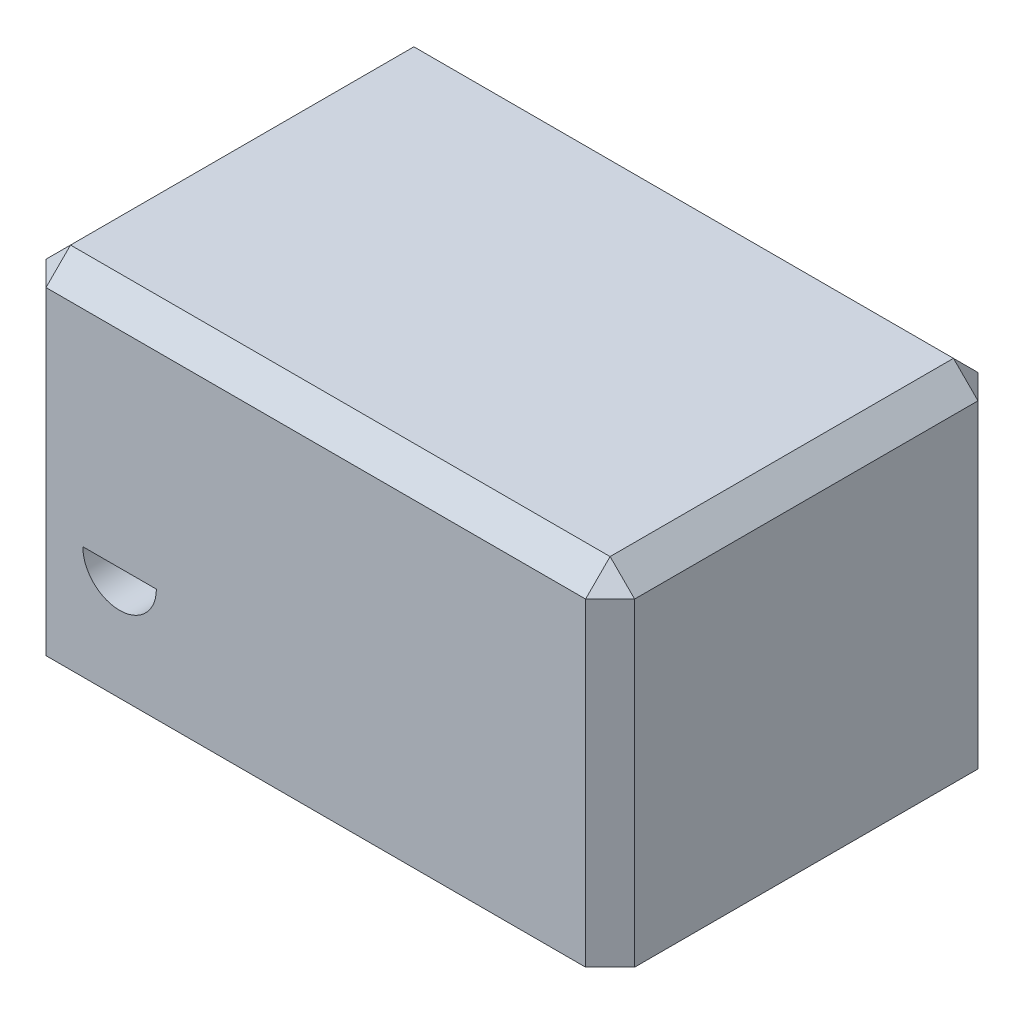
ISO-10303-21;
HEADER;
FILE_DESCRIPTION(('STEP AP214'),'2;1');
FILE_NAME('part.step','',(''),(''),'','','');
FILE_SCHEMA(('AUTOMOTIVE_DESIGN { 1 0 10303 214 1 1 1 1 }'));
ENDSEC;
DATA;
#1=APPLICATION_CONTEXT('core data for automotive mechanical design processes');
#2=APPLICATION_PROTOCOL_DEFINITION('international standard','automotive_design',2000,#1);
#3=PRODUCT_CONTEXT('',#1,'mechanical');
#4=PRODUCT('Part','Part','',(#3));
#5=PRODUCT_RELATED_PRODUCT_CATEGORY('part','',(#4));
#6=PRODUCT_DEFINITION_FORMATION('','',#4);
#7=PRODUCT_DEFINITION_CONTEXT('part definition',#1,'design');
#8=PRODUCT_DEFINITION('design','',#6,#7);
#9=PRODUCT_DEFINITION_SHAPE('','',#8);
#10=(LENGTH_UNIT() NAMED_UNIT(*) SI_UNIT(.MILLI.,.METRE.));
#11=(NAMED_UNIT(*) PLANE_ANGLE_UNIT() SI_UNIT($,.RADIAN.));
#12=(NAMED_UNIT(*) SI_UNIT($,.STERADIAN.) SOLID_ANGLE_UNIT());
#13=UNCERTAINTY_MEASURE_WITH_UNIT(LENGTH_MEASURE(1.E-05),#10,'distance_accuracy_value','');
#14=(GEOMETRIC_REPRESENTATION_CONTEXT(3) GLOBAL_UNCERTAINTY_ASSIGNED_CONTEXT((#13)) GLOBAL_UNIT_ASSIGNED_CONTEXT((#10,
#11,#12)) REPRESENTATION_CONTEXT('',''));
#15=CARTESIAN_POINT('',(0.,0.,0.));
#16=DIRECTION('',(0.,0.,1.));
#17=DIRECTION('',(1.,0.,0.));
#18=AXIS2_PLACEMENT_3D('',#15,#16,#17);
#19=CARTESIAN_POINT('',(0.,0.,-80.));
#20=DIRECTION('',(0.,0.,1.));
#21=DIRECTION('',(1.,0.,0.));
#22=AXIS2_PLACEMENT_3D('',#19,#20,#21);
#23=PLANE('',#22);
#24=DIRECTION('',(1.,0.,0.));
#25=VECTOR('',#24,1.);
#26=CARTESIAN_POINT('',(0.,65.,-80.));
#27=LINE('',#26,#25);
#28=CARTESIAN_POINT('',(5.00000000000002,65.,-80.));
#29=VERTEX_POINT('',#28);
#30=CARTESIAN_POINT('',(115.,65.,-80.));
#31=VERTEX_POINT('',#30);
#32=EDGE_CURVE('E181',#29,#31,#27,.T.);
#33=ORIENTED_EDGE('',*,*,#32,.T.);
#34=DIRECTION('',(0.,-1.,0.));
#35=VECTOR('',#34,1.);
#36=CARTESIAN_POINT('',(115.,0.,-80.));
#37=LINE('',#36,#35);
#38=CARTESIAN_POINT('',(115.,0.,-80.));
#39=VERTEX_POINT('',#38);
#40=EDGE_CURVE('E183',#31,#39,#37,.T.);
#41=ORIENTED_EDGE('',*,*,#40,.T.);
#42=DIRECTION('',(1.,0.,0.));
#43=VECTOR('',#42,1.);
#44=CARTESIAN_POINT('',(0.,0.,-80.));
#45=LINE('',#44,#43);
#46=CARTESIAN_POINT('',(5.00000000000002,0.,-80.));
#47=VERTEX_POINT('',#46);
#48=EDGE_CURVE('E146',#47,#39,#45,.T.);
#49=ORIENTED_EDGE('',*,*,#48,.F.);
#50=DIRECTION('',(0.,1.,0.));
#51=VECTOR('',#50,1.);
#52=CARTESIAN_POINT('',(5.00000000000002,0.,-80.));
#53=LINE('',#52,#51);
#54=EDGE_CURVE('E179',#47,#29,#53,.T.);
#55=ORIENTED_EDGE('',*,*,#54,.T.);
#56=EDGE_LOOP('',(#33,#41,#49,#55));
#57=FACE_BOUND('',#56,.T.);
#58=DIRECTION('',(1.,0.,0.));
#59=VECTOR('',#58,1.);
#60=CARTESIAN_POINT('',(12.5,23.,-80.));
#61=LINE('',#60,#59);
#62=CARTESIAN_POINT('',(12.5,23.,-80.));
#63=VERTEX_POINT('',#62);
#64=CARTESIAN_POINT('',(27.5,23.,-80.));
#65=VERTEX_POINT('',#64);
#66=EDGE_CURVE('E131',#63,#65,#61,.T.);
#67=ORIENTED_EDGE('',*,*,#66,.F.);
#68=CARTESIAN_POINT('',(20.,23.,-80.));
#69=DIRECTION('',(0.,0.,1.));
#70=DIRECTION('',(1.,0.,0.));
#71=AXIS2_PLACEMENT_3D('',#68,#69,#70);
#72=CIRCLE('',#71,7.50000000000001);
#73=EDGE_CURVE('E134',#63,#65,#72,.T.);
#74=ORIENTED_EDGE('',*,*,#73,.T.);
#75=EDGE_LOOP('',(#67,#74));
#76=FACE_BOUND('',#75,.T.);
#77=ADVANCED_FACE('F39',(#57,#76),#23,.F.);
#78=CARTESIAN_POINT('',(0.,0.,0.));
#79=DIRECTION('',(0.,0.,1.));
#80=DIRECTION('',(1.,0.,0.));
#81=AXIS2_PLACEMENT_3D('',#78,#79,#80);
#82=PLANE('',#81);
#83=DIRECTION('',(1.,0.,0.));
#84=VECTOR('',#83,1.);
#85=CARTESIAN_POINT('',(0.,0.,0.));
#86=LINE('',#85,#84);
#87=CARTESIAN_POINT('',(5.00000000000002,0.,0.));
#88=VERTEX_POINT('',#87);
#89=CARTESIAN_POINT('',(115.,0.,0.));
#90=VERTEX_POINT('',#89);
#91=EDGE_CURVE('E150',#88,#90,#86,.T.);
#92=ORIENTED_EDGE('',*,*,#91,.T.);
#93=DIRECTION('',(0.,1.,0.));
#94=VECTOR('',#93,1.);
#95=CARTESIAN_POINT('',(115.,1.8239378261699E-13,0.));
#96=LINE('',#95,#94);
#97=CARTESIAN_POINT('',(115.,65.,0.));
#98=VERTEX_POINT('',#97);
#99=EDGE_CURVE('E162',#90,#98,#96,.T.);
#100=ORIENTED_EDGE('',*,*,#99,.T.);
#101=DIRECTION('',(-1.,0.,0.));
#102=VECTOR('',#101,1.);
#103=CARTESIAN_POINT('',(0.,65.,0.));
#104=LINE('',#103,#102);
#105=CARTESIAN_POINT('',(5.00000000000002,65.,0.));
#106=VERTEX_POINT('',#105);
#107=EDGE_CURVE('E160',#98,#106,#104,.T.);
#108=ORIENTED_EDGE('',*,*,#107,.T.);
#109=DIRECTION('',(0.,-1.,0.));
#110=VECTOR('',#109,1.);
#111=CARTESIAN_POINT('',(5.00000000000002,0.,0.));
#112=LINE('',#111,#110);
#113=EDGE_CURVE('E156',#106,#88,#112,.T.);
#114=ORIENTED_EDGE('',*,*,#113,.T.);
#115=EDGE_LOOP('',(#92,#100,#108,#114));
#116=FACE_BOUND('',#115,.T.);
#117=CARTESIAN_POINT('',(20.,23.,0.));
#118=DIRECTION('',(0.,0.,1.));
#119=DIRECTION('',(1.,0.,0.));
#120=AXIS2_PLACEMENT_3D('',#117,#118,#119);
#121=CIRCLE('',#120,7.50000000000001);
#122=CARTESIAN_POINT('',(12.5,23.,0.));
#123=VERTEX_POINT('',#122);
#124=CARTESIAN_POINT('',(27.5,23.,0.));
#125=VERTEX_POINT('',#124);
#126=EDGE_CURVE('E139',#123,#125,#121,.T.);
#127=ORIENTED_EDGE('',*,*,#126,.F.);
#128=DIRECTION('',(1.,0.,0.));
#129=VECTOR('',#128,1.);
#130=CARTESIAN_POINT('',(12.5,23.,0.));
#131=LINE('',#130,#129);
#132=EDGE_CURVE('E64',#123,#125,#131,.T.);
#133=ORIENTED_EDGE('',*,*,#132,.T.);
#134=EDGE_LOOP('',(#127,#133));
#135=FACE_BOUND('',#134,.T.);
#136=ADVANCED_FACE('F295',(#116,#135),#82,.T.);
#137=CARTESIAN_POINT('',(0.,0.,-80.));
#138=DIRECTION('',(0.,-1.,0.));
#139=DIRECTION('',(0.,0.,-1.));
#140=AXIS2_PLACEMENT_3D('',#137,#138,#139);
#141=PLANE('',#140);
#142=DIRECTION('',(0.,0.,1.));
#143=VECTOR('',#142,1.);
#144=CARTESIAN_POINT('',(120.,0.,-80.));
#145=LINE('',#144,#143);
#146=CARTESIAN_POINT('',(120.,0.,-75.));
#147=VERTEX_POINT('',#146);
#148=CARTESIAN_POINT('',(120.,0.,-5.00000000000002));
#149=VERTEX_POINT('',#148);
#150=EDGE_CURVE('E149',#147,#149,#145,.T.);
#151=ORIENTED_EDGE('',*,*,#150,.T.);
#152=DIRECTION('',(0.707106781186548,0.,-0.707106781186548));
#153=VECTOR('',#152,1.);
#154=CARTESIAN_POINT('',(97.5,0.,17.5));
#155=LINE('',#154,#153);
#156=EDGE_CURVE('E177',#149,#90,#155,.F.);
#157=ORIENTED_EDGE('',*,*,#156,.T.);
#158=ORIENTED_EDGE('',*,*,#91,.F.);
#159=DIRECTION('',(-0.707106781186548,0.,-0.707106781186548));
#160=VECTOR('',#159,1.);
#161=CARTESIAN_POINT('',(-37.5,0.,-42.5));
#162=LINE('',#161,#160);
#163=CARTESIAN_POINT('',(0.,0.,-5.00000000000002));
#164=VERTEX_POINT('',#163);
#165=EDGE_CURVE('E171',#88,#164,#162,.T.);
#166=ORIENTED_EDGE('',*,*,#165,.T.);
#167=DIRECTION('',(0.,0.,1.));
#168=VECTOR('',#167,1.);
#169=CARTESIAN_POINT('',(0.,0.,-80.));
#170=LINE('',#169,#168);
#171=CARTESIAN_POINT('',(0.,0.,-75.));
#172=VERTEX_POINT('',#171);
#173=EDGE_CURVE('E153',#172,#164,#170,.T.);
#174=ORIENTED_EDGE('',*,*,#173,.F.);
#175=DIRECTION('',(-0.707106781186548,0.,0.707106781186548));
#176=VECTOR('',#175,1.);
#177=CARTESIAN_POINT('',(2.50000000000001,0.,-77.5));
#178=LINE('',#177,#176);
#179=EDGE_CURVE('E173',#172,#47,#178,.F.);
#180=ORIENTED_EDGE('',*,*,#179,.T.);
#181=ORIENTED_EDGE('',*,*,#48,.T.);
#182=DIRECTION('',(0.707106781186548,0.,0.707106781186548));
#183=VECTOR('',#182,1.);
#184=CARTESIAN_POINT('',(57.5,0.,-137.5));
#185=LINE('',#184,#183);
#186=EDGE_CURVE('E175',#39,#147,#185,.T.);
#187=ORIENTED_EDGE('',*,*,#186,.T.);
#188=EDGE_LOOP('',(#151,#157,#158,#166,#174,#180,#181,#187));
#189=FACE_BOUND('',#188,.T.);
#190=ADVANCED_FACE('F244',(#189),#141,.T.);
#191=CARTESIAN_POINT('',(0.,0.,-80.));
#192=DIRECTION('',(1.,0.,0.));
#193=DIRECTION('',(0.,0.,-1.));
#194=AXIS2_PLACEMENT_3D('',#191,#192,#193);
#195=PLANE('',#194);
#196=DIRECTION('',(0.,0.,-1.));
#197=VECTOR('',#196,1.);
#198=CARTESIAN_POINT('',(0.,65.,-80.));
#199=LINE('',#198,#197);
#200=CARTESIAN_POINT('',(0.,65.,-5.00000000000002));
#201=VERTEX_POINT('',#200);
#202=CARTESIAN_POINT('',(0.,65.,-75.));
#203=VERTEX_POINT('',#202);
#204=EDGE_CURVE('E49',#201,#203,#199,.T.);
#205=ORIENTED_EDGE('',*,*,#204,.T.);
#206=DIRECTION('',(0.,-1.,0.));
#207=VECTOR('',#206,1.);
#208=CARTESIAN_POINT('',(0.,0.,-75.));
#209=LINE('',#208,#207);
#210=EDGE_CURVE('E11',#203,#172,#209,.T.);
#211=ORIENTED_EDGE('',*,*,#210,.T.);
#212=ORIENTED_EDGE('',*,*,#173,.T.);
#213=DIRECTION('',(0.,1.,0.));
#214=VECTOR('',#213,1.);
#215=CARTESIAN_POINT('',(0.,70.,-5.00000000000002));
#216=LINE('',#215,#214);
#217=EDGE_CURVE('E194',#164,#201,#216,.T.);
#218=ORIENTED_EDGE('',*,*,#217,.T.);
#219=EDGE_LOOP('',(#205,#211,#212,#218));
#220=FACE_BOUND('',#219,.T.);
#221=ADVANCED_FACE('F241',(#220),#195,.F.);
#222=CARTESIAN_POINT('',(0.,70.,-80.));
#223=DIRECTION('',(0.,-1.,0.));
#224=DIRECTION('',(0.,0.,-1.));
#225=AXIS2_PLACEMENT_3D('',#222,#223,#224);
#226=PLANE('',#225);
#227=DIRECTION('',(1.,0.,0.));
#228=VECTOR('',#227,1.);
#229=CARTESIAN_POINT('',(120.,70.,-5.00000000000002));
#230=LINE('',#229,#228);
#231=CARTESIAN_POINT('',(5.00000000000002,70.,-5.00000000000002));
#232=VERTEX_POINT('',#231);
#233=CARTESIAN_POINT('',(115.,70.,-5.00000000000002));
#234=VERTEX_POINT('',#233);
#235=EDGE_CURVE('E187',#232,#234,#230,.T.);
#236=ORIENTED_EDGE('',*,*,#235,.T.);
#237=DIRECTION('',(0.,0.,-1.));
#238=VECTOR('',#237,1.);
#239=CARTESIAN_POINT('',(115.,70.,-80.));
#240=LINE('',#239,#238);
#241=CARTESIAN_POINT('',(115.,70.,-75.));
#242=VERTEX_POINT('',#241);
#243=EDGE_CURVE('E191',#234,#242,#240,.T.);
#244=ORIENTED_EDGE('',*,*,#243,.T.);
#245=DIRECTION('',(-1.,0.,0.));
#246=VECTOR('',#245,1.);
#247=CARTESIAN_POINT('',(0.,70.,-75.));
#248=LINE('',#247,#246);
#249=CARTESIAN_POINT('',(5.00000000000002,70.,-75.));
#250=VERTEX_POINT('',#249);
#251=EDGE_CURVE('E189',#242,#250,#248,.T.);
#252=ORIENTED_EDGE('',*,*,#251,.T.);
#253=DIRECTION('',(0.,0.,1.));
#254=VECTOR('',#253,1.);
#255=CARTESIAN_POINT('',(5.00000000000002,70.,-80.));
#256=LINE('',#255,#254);
#257=EDGE_CURVE('E185',#250,#232,#256,.T.);
#258=ORIENTED_EDGE('',*,*,#257,.T.);
#259=EDGE_LOOP('',(#236,#244,#252,#258));
#260=FACE_BOUND('',#259,.T.);
#261=ADVANCED_FACE('F264',(#260),#226,.F.);
#262=CARTESIAN_POINT('',(120.,0.,-80.));
#263=DIRECTION('',(1.,0.,0.));
#264=DIRECTION('',(0.,1.,0.));
#265=AXIS2_PLACEMENT_3D('',#262,#263,#264);
#266=PLANE('',#265);
#267=DIRECTION('',(0.,0.,1.));
#268=VECTOR('',#267,1.);
#269=CARTESIAN_POINT('',(120.,65.,0.));
#270=LINE('',#269,#268);
#271=CARTESIAN_POINT('',(120.,65.,-75.));
#272=VERTEX_POINT('',#271);
#273=CARTESIAN_POINT('',(120.,65.,-5.00000000000002));
#274=VERTEX_POINT('',#273);
#275=EDGE_CURVE('E165',#272,#274,#270,.T.);
#276=ORIENTED_EDGE('',*,*,#275,.T.);
#277=DIRECTION('',(0.,-1.,0.));
#278=VECTOR('',#277,1.);
#279=CARTESIAN_POINT('',(120.,0.,-5.00000000000002));
#280=LINE('',#279,#278);
#281=EDGE_CURVE('E169',#274,#149,#280,.T.);
#282=ORIENTED_EDGE('',*,*,#281,.T.);
#283=ORIENTED_EDGE('',*,*,#150,.F.);
#284=DIRECTION('',(0.,1.,0.));
#285=VECTOR('',#284,1.);
#286=CARTESIAN_POINT('',(120.,70.,-75.));
#287=LINE('',#286,#285);
#288=EDGE_CURVE('E167',#147,#272,#287,.T.);
#289=ORIENTED_EDGE('',*,*,#288,.T.);
#290=EDGE_LOOP('',(#276,#282,#283,#289));
#291=FACE_BOUND('',#290,.T.);
#292=ADVANCED_FACE('F287',(#291),#266,.T.);
#293=CARTESIAN_POINT('',(5.00000000000002,0.,-80.));
#294=DIRECTION('',(0.707106781186547,0.,0.707106781186547));
#295=DIRECTION('',(0.,1.,0.));
#296=AXIS2_PLACEMENT_3D('',#293,#294,#295);
#297=PLANE('',#296);
#298=DIRECTION('',(0.707106781186547,0.,-0.707106781186547));
#299=VECTOR('',#298,1.);
#300=CARTESIAN_POINT('',(2.50000000000001,65.,-77.5));
#301=LINE('',#300,#299);
#302=EDGE_CURVE('E44',#29,#203,#301,.F.);
#303=ORIENTED_EDGE('',*,*,#302,.F.);
#304=ORIENTED_EDGE('',*,*,#54,.F.);
#305=ORIENTED_EDGE('',*,*,#179,.F.);
#306=ORIENTED_EDGE('',*,*,#210,.F.);
#307=EDGE_LOOP('',(#303,#304,#305,#306));
#308=FACE_BOUND('',#307,.T.);
#309=ADVANCED_FACE('F42',(#308),#297,.F.);
#310=CARTESIAN_POINT('',(5.00000000000002,70.,-75.));
#311=DIRECTION('',(-0.577350269189626,0.577350269189626,-0.577350269189626));
#312=DIRECTION('',(-0.707106781186547,0.,0.707106781186547));
#313=AXIS2_PLACEMENT_3D('',#310,#311,#312);
#314=PLANE('',#313);
#315=DIRECTION('',(0.,0.707106781186547,0.707106781186547));
#316=VECTOR('',#315,1.);
#317=CARTESIAN_POINT('',(5.00000000000002,70.,-75.));
#318=LINE('',#317,#316);
#319=EDGE_CURVE('E221',#29,#250,#318,.T.);
#320=ORIENTED_EDGE('',*,*,#319,.F.);
#321=ORIENTED_EDGE('',*,*,#302,.T.);
#322=DIRECTION('',(-0.707106781186547,-0.707106781186547,0.));
#323=VECTOR('',#322,1.);
#324=CARTESIAN_POINT('',(5.00000000000002,70.,-75.));
#325=LINE('',#324,#323);
#326=EDGE_CURVE('E223',#250,#203,#325,.T.);
#327=ORIENTED_EDGE('',*,*,#326,.F.);
#328=EDGE_LOOP('',(#320,#321,#327));
#329=FACE_BOUND('',#328,.T.);
#330=ADVANCED_FACE('F233',(#329),#314,.T.);
#331=CARTESIAN_POINT('',(0.,0.,-5.00000000000002));
#332=DIRECTION('',(-0.707106781186547,0.,0.707106781186547));
#333=DIRECTION('',(0.,-1.,0.));
#334=AXIS2_PLACEMENT_3D('',#331,#332,#333);
#335=PLANE('',#334);
#336=ORIENTED_EDGE('',*,*,#165,.F.);
#337=ORIENTED_EDGE('',*,*,#113,.F.);
#338=DIRECTION('',(0.707106781186547,0.,0.707106781186547));
#339=VECTOR('',#338,1.);
#340=CARTESIAN_POINT('',(5.00000000000002,65.,0.));
#341=LINE('',#340,#339);
#342=EDGE_CURVE('E218',#201,#106,#341,.T.);
#343=ORIENTED_EDGE('',*,*,#342,.F.);
#344=ORIENTED_EDGE('',*,*,#217,.F.);
#345=EDGE_LOOP('',(#336,#337,#343,#344));
#346=FACE_BOUND('',#345,.T.);
#347=ADVANCED_FACE('F250',(#346),#335,.T.);
#348=CARTESIAN_POINT('',(5.00000000000002,70.,-80.));
#349=DIRECTION('',(0.707106781186547,-0.707106781186547,0.));
#350=DIRECTION('',(0.,0.,1.));
#351=AXIS2_PLACEMENT_3D('',#348,#349,#350);
#352=PLANE('',#351);
#353=ORIENTED_EDGE('',*,*,#326,.T.);
#354=ORIENTED_EDGE('',*,*,#204,.F.);
#355=DIRECTION('',(0.707106781186547,0.707106781186547,0.));
#356=VECTOR('',#355,1.);
#357=CARTESIAN_POINT('',(2.50000000000001,67.5,-5.00000000000002));
#358=LINE('',#357,#356);
#359=EDGE_CURVE('E215',#232,#201,#358,.F.);
#360=ORIENTED_EDGE('',*,*,#359,.F.);
#361=ORIENTED_EDGE('',*,*,#257,.F.);
#362=EDGE_LOOP('',(#353,#354,#360,#361));
#363=FACE_BOUND('',#362,.T.);
#364=ADVANCED_FACE('F253',(#363),#352,.F.);
#365=CARTESIAN_POINT('',(0.,65.,-80.));
#366=DIRECTION('',(0.,-0.707106781186547,0.707106781186547));
#367=DIRECTION('',(1.,0.,0.));
#368=AXIS2_PLACEMENT_3D('',#365,#366,#367);
#369=PLANE('',#368);
#370=ORIENTED_EDGE('',*,*,#319,.T.);
#371=ORIENTED_EDGE('',*,*,#251,.F.);
#372=DIRECTION('',(0.,-0.707106781186547,-0.707106781186547));
#373=VECTOR('',#372,1.);
#374=CARTESIAN_POINT('',(115.,67.5,-77.5));
#375=LINE('',#374,#373);
#376=EDGE_CURVE('E212',#31,#242,#375,.F.);
#377=ORIENTED_EDGE('',*,*,#376,.F.);
#378=ORIENTED_EDGE('',*,*,#32,.F.);
#379=EDGE_LOOP('',(#370,#371,#377,#378));
#380=FACE_BOUND('',#379,.T.);
#381=ADVANCED_FACE('F277',(#380),#369,.F.);
#382=CARTESIAN_POINT('',(120.,0.,-75.));
#383=DIRECTION('',(0.707106781186547,0.,-0.707106781186547));
#384=DIRECTION('',(0.,-1.,0.));
#385=AXIS2_PLACEMENT_3D('',#382,#383,#384);
#386=PLANE('',#385);
#387=ORIENTED_EDGE('',*,*,#186,.F.);
#388=ORIENTED_EDGE('',*,*,#40,.F.);
#389=DIRECTION('',(-0.707106781186548,0.,-0.707106781186548));
#390=VECTOR('',#389,1.);
#391=CARTESIAN_POINT('',(120.,65.,-75.));
#392=LINE('',#391,#390);
#393=EDGE_CURVE('E209',#272,#31,#392,.T.);
#394=ORIENTED_EDGE('',*,*,#393,.F.);
#395=ORIENTED_EDGE('',*,*,#288,.F.);
#396=EDGE_LOOP('',(#387,#388,#394,#395));
#397=FACE_BOUND('',#396,.T.);
#398=ADVANCED_FACE('F282',(#397),#386,.T.);
#399=CARTESIAN_POINT('',(5.00000000000002,65.,0.));
#400=DIRECTION('',(-0.577350269189626,0.577350269189626,0.577350269189626));
#401=DIRECTION('',(0.707106781186547,0.,0.707106781186547));
#402=AXIS2_PLACEMENT_3D('',#399,#400,#401);
#403=PLANE('',#402);
#404=ORIENTED_EDGE('',*,*,#359,.T.);
#405=ORIENTED_EDGE('',*,*,#342,.T.);
#406=DIRECTION('',(0.,0.707106781186547,-0.707106781186547));
#407=VECTOR('',#406,1.);
#408=CARTESIAN_POINT('',(5.00000000000002,65.,0.));
#409=LINE('',#408,#407);
#410=EDGE_CURVE('E206',#232,#106,#409,.F.);
#411=ORIENTED_EDGE('',*,*,#410,.F.);
#412=EDGE_LOOP('',(#404,#405,#411));
#413=FACE_BOUND('',#412,.T.);
#414=ADVANCED_FACE('F257',(#413),#403,.T.);
#415=CARTESIAN_POINT('',(120.,65.,-75.));
#416=DIRECTION('',(0.577350269189625,0.577350269189626,-0.577350269189626));
#417=DIRECTION('',(0.,0.707106781186547,0.707106781186547));
#418=AXIS2_PLACEMENT_3D('',#415,#416,#417);
#419=PLANE('',#418);
#420=ORIENTED_EDGE('',*,*,#393,.T.);
#421=ORIENTED_EDGE('',*,*,#376,.T.);
#422=DIRECTION('',(0.707106781186548,-0.707106781186546,0.));
#423=VECTOR('',#422,1.);
#424=CARTESIAN_POINT('',(120.,65.,-75.));
#425=LINE('',#424,#423);
#426=EDGE_CURVE('E204',#272,#242,#425,.F.);
#427=ORIENTED_EDGE('',*,*,#426,.F.);
#428=EDGE_LOOP('',(#420,#421,#427));
#429=FACE_BOUND('',#428,.T.);
#430=ADVANCED_FACE('F274',(#429),#419,.T.);
#431=CARTESIAN_POINT('',(0.,70.,-5.00000000000002));
#432=DIRECTION('',(0.,0.707106781186547,0.707106781186547));
#433=DIRECTION('',(-1.,0.,0.));
#434=AXIS2_PLACEMENT_3D('',#431,#432,#433);
#435=PLANE('',#434);
#436=ORIENTED_EDGE('',*,*,#410,.T.);
#437=ORIENTED_EDGE('',*,*,#107,.F.);
#438=DIRECTION('',(0.,-0.707106781186548,0.707106781186548));
#439=VECTOR('',#438,1.);
#440=CARTESIAN_POINT('',(115.,65.,0.));
#441=LINE('',#440,#439);
#442=EDGE_CURVE('E201',#234,#98,#441,.T.);
#443=ORIENTED_EDGE('',*,*,#442,.F.);
#444=ORIENTED_EDGE('',*,*,#235,.F.);
#445=EDGE_LOOP('',(#436,#437,#443,#444));
#446=FACE_BOUND('',#445,.T.);
#447=ADVANCED_FACE('F261',(#446),#435,.T.);
#448=CARTESIAN_POINT('',(120.,65.,-80.));
#449=DIRECTION('',(0.707106781186547,0.707106781186549,0.));
#450=DIRECTION('',(0.,0.,-1.));
#451=AXIS2_PLACEMENT_3D('',#448,#449,#450);
#452=PLANE('',#451);
#453=ORIENTED_EDGE('',*,*,#426,.T.);
#454=ORIENTED_EDGE('',*,*,#243,.F.);
#455=DIRECTION('',(-0.707106781186548,0.707106781186546,0.));
#456=VECTOR('',#455,1.);
#457=CARTESIAN_POINT('',(117.5,67.5,-5.00000000000002));
#458=LINE('',#457,#456);
#459=EDGE_CURVE('E198',#274,#234,#458,.T.);
#460=ORIENTED_EDGE('',*,*,#459,.F.);
#461=ORIENTED_EDGE('',*,*,#275,.F.);
#462=EDGE_LOOP('',(#453,#454,#460,#461));
#463=FACE_BOUND('',#462,.T.);
#464=ADVANCED_FACE('F267',(#463),#452,.T.);
#465=CARTESIAN_POINT('',(115.,65.,0.));
#466=DIRECTION('',(0.577350269189625,0.577350269189626,0.577350269189626));
#467=DIRECTION('',(0.,-0.707106781186547,0.707106781186547));
#468=AXIS2_PLACEMENT_3D('',#465,#466,#467);
#469=PLANE('',#468);
#470=ORIENTED_EDGE('',*,*,#459,.T.);
#471=ORIENTED_EDGE('',*,*,#442,.T.);
#472=DIRECTION('',(-0.707106781186548,0.,0.707106781186548));
#473=VECTOR('',#472,1.);
#474=CARTESIAN_POINT('',(115.,65.,0.));
#475=LINE('',#474,#473);
#476=EDGE_CURVE('E145',#274,#98,#475,.T.);
#477=ORIENTED_EDGE('',*,*,#476,.F.);
#478=EDGE_LOOP('',(#470,#471,#477));
#479=FACE_BOUND('',#478,.T.);
#480=ADVANCED_FACE('F293',(#479),#469,.T.);
#481=CARTESIAN_POINT('',(115.,1.8239378261699E-13,0.));
#482=DIRECTION('',(-0.707106781186547,0.,-0.707106781186547));
#483=DIRECTION('',(0.,1.,0.));
#484=AXIS2_PLACEMENT_3D('',#481,#482,#483);
#485=PLANE('',#484);
#486=ORIENTED_EDGE('',*,*,#156,.F.);
#487=ORIENTED_EDGE('',*,*,#281,.F.);
#488=ORIENTED_EDGE('',*,*,#476,.T.);
#489=ORIENTED_EDGE('',*,*,#99,.F.);
#490=EDGE_LOOP('',(#486,#487,#488,#489));
#491=FACE_BOUND('',#490,.T.);
#492=ADVANCED_FACE('F290',(#491),#485,.F.);
#493=CARTESIAN_POINT('',(12.5,23.,-80.));
#494=DIRECTION('',(0.,-1.,0.));
#495=DIRECTION('',(0.,0.,-1.));
#496=AXIS2_PLACEMENT_3D('',#493,#494,#495);
#497=PLANE('',#496);
#498=ORIENTED_EDGE('',*,*,#132,.F.);
#499=DIRECTION('',(0.,0.,1.));
#500=VECTOR('',#499,1.);
#501=CARTESIAN_POINT('',(12.5,23.,-80.));
#502=LINE('',#501,#500);
#503=EDGE_CURVE('E128',#63,#123,#502,.T.);
#504=ORIENTED_EDGE('',*,*,#503,.F.);
#505=ORIENTED_EDGE('',*,*,#66,.T.);
#506=DIRECTION('',(0.,0.,1.));
#507=VECTOR('',#506,1.);
#508=CARTESIAN_POINT('',(27.5,23.,-80.));
#509=LINE('',#508,#507);
#510=EDGE_CURVE('E57',#65,#125,#509,.T.);
#511=ORIENTED_EDGE('',*,*,#510,.T.);
#512=EDGE_LOOP('',(#498,#504,#505,#511));
#513=FACE_BOUND('',#512,.T.);
#514=ADVANCED_FACE('F129',(#513),#497,.T.);
#515=CARTESIAN_POINT('',(20.,23.,-80.));
#516=DIRECTION('',(0.,0.,1.));
#517=DIRECTION('',(1.,0.,0.));
#518=AXIS2_PLACEMENT_3D('',#515,#516,#517);
#519=CYLINDRICAL_SURFACE('',#518,7.50000000000001);
#520=ORIENTED_EDGE('',*,*,#126,.T.);
#521=ORIENTED_EDGE('',*,*,#510,.F.);
#522=ORIENTED_EDGE('',*,*,#73,.F.);
#523=ORIENTED_EDGE('',*,*,#503,.T.);
#524=EDGE_LOOP('',(#520,#521,#522,#523));
#525=FACE_BOUND('',#524,.T.);
#526=ADVANCED_FACE('F136',(#525),#519,.F.);
#527=CLOSED_SHELL('',(#77,#136,#190,#221,#261,#292,#309,#330,#347,#364,#381,#398,#414,#430,#447,
#464,#480,#492,#514,#526));
#528=MANIFOLD_SOLID_BREP('B2',#527);
#529=ADVANCED_BREP_SHAPE_REPRESENTATION('',(#18,#528),#14);
#530=SHAPE_DEFINITION_REPRESENTATION(#9,#529);
ENDSEC;
END-ISO-10303-21;
